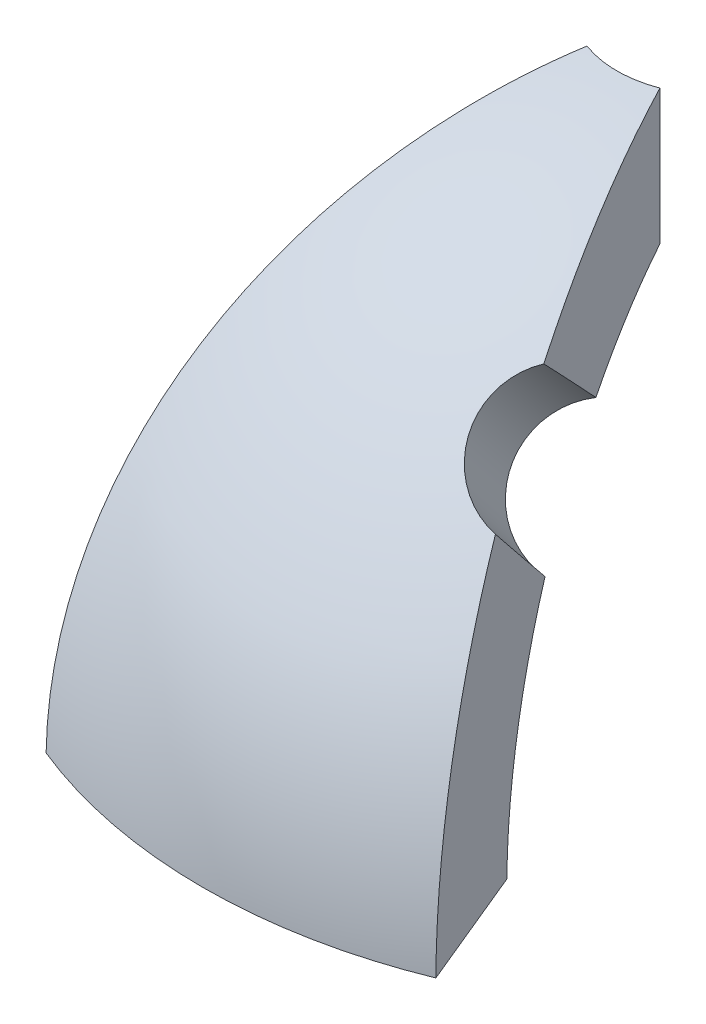
ISO-10303-21;
HEADER;
FILE_DESCRIPTION(('STEP AP214'),'2;1');
FILE_NAME('part.step','',(''),(''),'','','');
FILE_SCHEMA(('AUTOMOTIVE_DESIGN { 1 0 10303 214 1 1 1 1 }'));
ENDSEC;
DATA;
#1=APPLICATION_CONTEXT('core data for automotive mechanical design processes');
#2=APPLICATION_PROTOCOL_DEFINITION('international standard','automotive_design',2000,#1);
#3=PRODUCT_CONTEXT('',#1,'mechanical');
#4=PRODUCT('Part','Part','',(#3));
#5=PRODUCT_RELATED_PRODUCT_CATEGORY('part','',(#4));
#6=PRODUCT_DEFINITION_FORMATION('','',#4);
#7=PRODUCT_DEFINITION_CONTEXT('part definition',#1,'design');
#8=PRODUCT_DEFINITION('design','',#6,#7);
#9=PRODUCT_DEFINITION_SHAPE('','',#8);
#10=(LENGTH_UNIT() NAMED_UNIT(*) SI_UNIT(.MILLI.,.METRE.));
#11=(NAMED_UNIT(*) PLANE_ANGLE_UNIT() SI_UNIT($,.RADIAN.));
#12=(NAMED_UNIT(*) SI_UNIT($,.STERADIAN.) SOLID_ANGLE_UNIT());
#13=UNCERTAINTY_MEASURE_WITH_UNIT(LENGTH_MEASURE(1.E-05),#10,'distance_accuracy_value','');
#14=(GEOMETRIC_REPRESENTATION_CONTEXT(3) GLOBAL_UNCERTAINTY_ASSIGNED_CONTEXT((#13)) GLOBAL_UNIT_ASSIGNED_CONTEXT((#10,
#11,#12)) REPRESENTATION_CONTEXT('',''));
#15=CARTESIAN_POINT('',(0.,0.,0.));
#16=DIRECTION('',(0.,0.,1.));
#17=DIRECTION('',(1.,0.,0.));
#18=AXIS2_PLACEMENT_3D('',#15,#16,#17);
#19=CARTESIAN_POINT('',(7.17384970083417,0.249999999999994,17.6458459833991));
#20=DIRECTION('',(0.923879532511287,0.,-0.382683432365091));
#21=DIRECTION('',(-0.38268343236509,0.,-0.923879532511286));
#22=AXIS2_PLACEMENT_3D('',#19,#20,#21);
#23=PLANE('',#22);
#24=CARTESIAN_POINT('',(-0.723291696660623,-1.59318685539807,-1.41953988241083));
#25=DIRECTION('',(0.923879532511287,0.,-0.382683432365091));
#26=DIRECTION('',(0.270180002552571,0.7081975069357,0.652272226444413));
#27=AXIS2_PLACEMENT_3D('',#24,#25,#26);
#28=ELLIPSE('',#27,46.9277013134413,2.6035);
#29=CARTESIAN_POINT('',(5.62270364454241,11.7494069814732,13.901048137078));
#30=VERTEX_POINT('',#29);
#31=CARTESIAN_POINT('',(4.33112779241204,8.19625663572259,10.7829081980312));
#32=VERTEX_POINT('',#31);
#33=EDGE_CURVE('E11',#30,#32,#28,.T.);
#34=ORIENTED_EDGE('',*,*,#33,.F.);
#35=CARTESIAN_POINT('',(-0.115484941563909,0.,0.0478354290456357));
#36=DIRECTION('',(0.923879532511287,0.,-0.382683432365091));
#37=DIRECTION('',(-0.38268343236509,0.,-0.923879532511286));
#38=AXIS2_PLACEMENT_3D('',#35,#36,#37);
#39=CIRCLE('',#38,19.0495898905987);
#40=CARTESIAN_POINT('',(7.17384970083417,0.249999999999994,17.6458459833991));
#41=VERTEX_POINT('',#40);
#42=EDGE_CURVE('E172',#30,#41,#39,.T.);
#43=ORIENTED_EDGE('',*,*,#42,.T.);
#44=DIRECTION('',(-0.38268343236509,0.,-0.923879532511286));
#45=VECTOR('',#44,1.);
#46=CARTESIAN_POINT('',(5.32543241311731,0.249999999999995,13.1833718984682));
#47=LINE('',#46,#45);
#48=CARTESIAN_POINT('',(5.32522212941495,0.249999999999996,13.182864228702));
#49=VERTEX_POINT('',#48);
#50=EDGE_CURVE('E163',#41,#49,#47,.T.);
#51=ORIENTED_EDGE('',*,*,#50,.T.);
#52=CARTESIAN_POINT('',(-0.115484941563909,0.,0.0478354290456357));
#53=DIRECTION('',(0.923879532511287,0.,-0.382683432365091));
#54=DIRECTION('',(-0.38268343236509,0.,-0.923879532511286));
#55=AXIS2_PLACEMENT_3D('',#52,#53,#54);
#56=CIRCLE('',#55,14.2194505871359);
#57=EDGE_CURVE('E179',#49,#32,#56,.F.);
#58=ORIENTED_EDGE('',*,*,#57,.T.);
#59=EDGE_LOOP('',(#34,#43,#51,#58));
#60=FACE_BOUND('',#59,.T.);
#61=ADVANCED_FACE('F35',(#60),#23,.T.);
#62=CARTESIAN_POINT('',(0.,0.,0.));
#63=DIRECTION('',(0.,-1.,0.));
#64=DIRECTION('',(0.382683432365091,0.,0.923879532511287));
#65=AXIS2_PLACEMENT_3D('',#62,#63,#64);
#66=SPHERICAL_SURFACE('',#65,14.22);
#67=CARTESIAN_POINT('',(-1.48166666666667,0.,0.));
#68=DIRECTION('',(1.,0.,0.));
#69=DIRECTION('',(0.,0.,-1.));
#70=AXIS2_PLACEMENT_3D('',#67,#68,#69);
#71=CIRCLE('',#70,14.1425974944099);
#72=CARTESIAN_POINT('',(-1.48166666666667,2.02649613146278,13.9966559334026));
#73=VERTEX_POINT('',#72);
#74=CARTESIAN_POINT('',(-1.48166666666667,1.55783938000513,14.0565358589872));
#75=VERTEX_POINT('',#74);
#76=EDGE_CURVE('E437',#73,#75,#71,.T.);
#77=ORIENTED_EDGE('',*,*,#76,.T.);
#78=CARTESIAN_POINT('',(0.,-3.64003682813778,1.50775262175221));
#79=DIRECTION('',(0.,0.923879532511287,-0.38268343236509));
#80=DIRECTION('',(0.,0.38268343236509,0.923879532511287));
#81=AXIS2_PLACEMENT_3D('',#78,#79,#80);
#82=CIRCLE('',#81,13.6632797644416);
#83=CARTESIAN_POINT('',(1.53865384615384,1.55541413891811,14.0506808090629));
#84=VERTEX_POINT('',#83);
#85=EDGE_CURVE('E424',#75,#84,#82,.T.);
#86=ORIENTED_EDGE('',*,*,#85,.T.);
#87=CARTESIAN_POINT('',(-1.14656520887621,-0.992633987450935,0.411162460074659));
#88=DIRECTION('',(-0.729691385153425,-0.63172723508972,0.261669988494619));
#89=DIRECTION('',(0.654532858144621,-0.756033555875024,0.));
#90=AXIS2_PLACEMENT_3D('',#87,#88,#89);
#91=CIRCLE('',#90,14.132919423112);
#92=CARTESIAN_POINT('',(-0.185208333333334,3.44115359806134,13.7961066894908));
#93=VERTEX_POINT('',#92);
#94=EDGE_CURVE('E265',#84,#93,#91,.T.);
#95=ORIENTED_EDGE('',*,*,#94,.T.);
#96=CARTESIAN_POINT('',(-1.02576923076923,4.73842442043193,13.3680040206854));
#97=CARTESIAN_POINT('',(-1.01510319695056,4.47777713700594,13.4612115287235));
#98=CARTESIAN_POINT('',(-0.898431747941723,4.23448889858206,13.5478813537785));
#99=CARTESIAN_POINT('',(-0.563340129394557,3.82530552640254,13.6869591415432));
#100=CARTESIAN_POINT('',(-0.374186438591005,3.63370761876325,13.7455410990114));
#101=CARTESIAN_POINT('',(-0.185208333333334,3.44115359806134,13.7961066894908));
#102=B_SPLINE_CURVE_WITH_KNOTS('',3,(#96,#97,#98,#99,#100,#101),.UNSPECIFIED.,.F.,.F.,(4,2,4),
(0.,0.5,1.),.UNSPECIFIED.);
#103=CARTESIAN_POINT('',(-1.02576923076923,4.73842442043193,13.3680040206854));
#104=VERTEX_POINT('',#103);
#105=EDGE_CURVE('E252',#104,#93,#102,.T.);
#106=ORIENTED_EDGE('',*,*,#105,.F.);
#107=CARTESIAN_POINT('',(-0.0614393028846162,5.59206148575123,13.0741528808424));
#108=CARTESIAN_POINT('',(-0.181431455087626,5.58893674778118,13.074925511602));
#109=CARTESIAN_POINT('',(-0.303817751233514,5.57407301691507,13.0789989392794));
#110=CARTESIAN_POINT('',(-0.416529017767411,5.53488020885885,13.091982456868));
#111=CARTESIAN_POINT('',(-0.530319753611987,5.49531203962715,13.1050903214649));
#112=CARTESIAN_POINT('',(-0.636925682618907,5.43243464547075,13.1265404918891));
#113=CARTESIAN_POINT('',(-0.726940523888714,5.35567269757998,13.1528220329755));
#114=CARTESIAN_POINT('',(-0.806313997891765,5.28798538747221,13.1759966249511));
#115=CARTESIAN_POINT('',(-0.876464564094106,5.20767506981655,13.2034748841787));
#116=CARTESIAN_POINT('',(-0.926661813888501,5.11856233540297,13.2344254692554));
#117=CARTESIAN_POINT('',(-0.975537275994764,5.0317961063395,13.2645610674062));
#118=CARTESIAN_POINT('',(-1.00793220659945,4.93487749186068,13.2985067639493));
#119=CARTESIAN_POINT('',(-1.01983995447226,4.83742503827839,13.3329533662388));
#120=CARTESIAN_POINT('',(-1.02385286841137,4.80458353763878,13.3445618796168));
#121=CARTESIAN_POINT('',(-1.02484717427356,4.77148364777918,13.3563565950294));
#122=CARTESIAN_POINT('',(-1.02576923076923,4.73842442043193,13.3680040206854));
#123=B_SPLINE_CURVE_WITH_KNOTS('',3,(#107,#108,#109,#110,#111,#112,#113,#114,#115,#116,#117,
#118,#119,#120,#121,#122),.UNSPECIFIED.,.F.,.F.,(4,3,3,3,3,4),(0.,0.246669412520798,
0.496293305523043,0.715573496650327,0.929171565128119,1.),.UNSPECIFIED.);
#124=CARTESIAN_POINT('',(-0.0614393028846169,5.59206148575123,13.0741528808424));
#125=VERTEX_POINT('',#124);
#126=EDGE_CURVE('E263',#125,#104,#123,.T.);
#127=ORIENTED_EDGE('',*,*,#126,.F.);
#128=CARTESIAN_POINT('',(0.96878205128205,4.62209395592513,13.4129082901403));
#129=CARTESIAN_POINT('',(0.953500775688128,4.77247497543825,13.3621906559668));
#130=CARTESIAN_POINT('',(0.923044847697753,4.92508352699751,13.3088452056543));
#131=CARTESIAN_POINT('',(0.855145508072125,5.06126216850062,13.2612499946924));
#132=CARTESIAN_POINT('',(0.808724977756618,5.15436299674245,13.2287107248628));
#133=CARTESIAN_POINT('',(0.745897012433539,5.24174805606234,13.1980300195728));
#134=CARTESIAN_POINT('',(0.670245705492799,5.31578095080346,13.1720022615145));
#135=CARTESIAN_POINT('',(0.594412641437047,5.38999171432051,13.1459119700988));
#136=CARTESIAN_POINT('',(0.503545715592896,5.45286776380939,13.1237575967041));
#137=CARTESIAN_POINT('',(0.405099082413731,5.49758841111125,13.1080439576408));
#138=CARTESIAN_POINT('',(0.311601318038426,5.54006097120918,13.0931202362785));
#139=CARTESIAN_POINT('',(0.209546117781219,5.56804465052542,13.0832770230575));
#140=CARTESIAN_POINT('',(0.106757843166381,5.58143391070576,13.0784019766701));
#141=CARTESIAN_POINT('',(0.0510947696715673,5.58868461489602,13.0757619862007));
#142=CARTESIAN_POINT('',(-0.00526218903816884,5.59085895447196,13.0749312189617));
#143=CARTESIAN_POINT('',(-0.0614393028846162,5.59206148575123,13.0741528808424));
#144=B_SPLINE_CURVE_WITH_KNOTS('',3,(#128,#129,#130,#131,#132,#133,#134,#135,#136,#137,#138,
#139,#140,#141,#142,#143),.UNSPECIFIED.,.F.,.F.,(4,3,3,3,3,4),(0.,0.298387709774103,
0.500936586454012,0.704289141341412,0.89673405736526,1.),.UNSPECIFIED.);
#145=CARTESIAN_POINT('',(0.96878205128205,4.62209395592513,13.4129082901403));
#146=VERTEX_POINT('',#145);
#147=EDGE_CURVE('E543',#146,#125,#144,.T.);
#148=ORIENTED_EDGE('',*,*,#147,.F.);
#149=CARTESIAN_POINT('',(0.,-0.796975235975162,0.330117951616407));
#150=DIRECTION('',(0.,0.923879532511287,-0.38268343236509));
#151=DIRECTION('',(0.,0.38268343236509,0.923879532511287));
#152=AXIS2_PLACEMENT_3D('',#149,#150,#151);
#153=CIRCLE('',#152,14.1938103626638);
#154=CARTESIAN_POINT('',(1.36769230769231,4.60948536997282,13.3824684709319));
#155=VERTEX_POINT('',#154);
#156=EDGE_CURVE('E555',#146,#155,#153,.T.);
#157=ORIENTED_EDGE('',*,*,#156,.T.);
#158=CARTESIAN_POINT('',(-0.081919070512821,6.00841565746439,12.8880033578915));
#159=CARTESIAN_POINT('',(0.0861624956004355,6.00542114657256,12.8904677700206));
#160=CARTESIAN_POINT('',(0.257167264565181,5.98457253542038,12.8978844396908));
#161=CARTESIAN_POINT('',(0.415863302486591,5.93236189045178,12.9167542406891));
#162=CARTESIAN_POINT('',(0.576051262515946,5.87966040641422,12.9358014391427));
#163=CARTESIAN_POINT('',(0.727060910460557,5.79474850115833,12.9664749514095));
#164=CARTESIAN_POINT('',(0.854625462712611,5.6893688157893,13.004195392119));
#165=CARTESIAN_POINT('',(0.966467495898822,5.59697733194739,13.0372667329197));
#166=CARTESIAN_POINT('',(1.06552463446943,5.4881938867869,13.0757379774391));
#167=CARTESIAN_POINT('',(1.14372693429423,5.36879958258044,13.1177848641402));
#168=CARTESIAN_POINT('',(1.23258494871155,5.23313681015187,13.1655609893062));
#169=CARTESIAN_POINT('',(1.29486443738675,5.07971491243854,13.219561459815));
#170=CARTESIAN_POINT('',(1.32944724900957,4.92345524328022,13.274055841359));
#171=CARTESIAN_POINT('',(1.35224515215387,4.82044474078882,13.3099799774848));
#172=CARTESIAN_POINT('',(1.36223638649342,4.71490535377315,13.3467149884847));
#173=CARTESIAN_POINT('',(1.36769230769231,4.60948536997282,13.3824684709319));
#174=B_SPLINE_CURVE_WITH_KNOTS('',3,(#158,#159,#160,#161,#162,#163,#164,#165,#166,#167,#168,
#169,#170,#171,#172,#173),.UNSPECIFIED.,.F.,.F.,(4,3,3,3,3,4),(0.,0.21932127120366,
0.441568870801488,0.635043826918676,0.855885189682541,1.),.UNSPECIFIED.);
#175=CARTESIAN_POINT('',(-0.081919070512821,6.00841565746439,12.8880033578915));
#176=VERTEX_POINT('',#175);
#177=EDGE_CURVE('E205',#176,#155,#174,.T.);
#178=ORIENTED_EDGE('',*,*,#177,.F.);
#179=CARTESIAN_POINT('',(-1.42467948717949,4.75880335688474,13.3241314527181));
#180=CARTESIAN_POINT('',(-1.41998123570896,4.90687898443499,13.2717476036515));
#181=CARTESIAN_POINT('',(-1.39870962604896,5.05722855256801,13.2174560064247));
#182=CARTESIAN_POINT('',(-1.34521028583592,5.19644980960188,13.1679808119229));
#183=CARTESIAN_POINT('',(-1.29129419152762,5.33675558522578,13.1181202109873));
#184=CARTESIAN_POINT('',(-1.20654594179884,5.46873177523107,13.0717519252903));
#185=CARTESIAN_POINT('',(-1.10337881431458,5.5820880392036,13.031931871933));
#186=CARTESIAN_POINT('',(-1.00734704400751,5.68760423384941,12.9948658964534));
#187=CARTESIAN_POINT('',(-0.89204271975123,5.78069257376337,12.9621750801536));
#188=CARTESIAN_POINT('',(-0.763987364254898,5.84976700409645,12.938506455733));
#189=CARTESIAN_POINT('',(-0.637629389595678,5.91792584902564,12.9151515602413));
#190=CARTESIAN_POINT('',(-0.495452932696475,5.963036029263,12.9006311908464));
#191=CARTESIAN_POINT('',(-0.352111836121691,5.98671363109362,12.8935517664506));
#192=CARTESIAN_POINT('',(-0.263052546929301,6.00142476725208,12.8891532476751));
#193=CARTESIAN_POINT('',(-0.172266932809541,6.00631316004938,12.8884092753436));
#194=CARTESIAN_POINT('',(-0.081919070512821,6.00841565746439,12.8880033578915));
#195=B_SPLINE_CURVE_WITH_KNOTS('',3,(#179,#180,#181,#182,#183,#184,#185,#186,#187,#188,#189,
#190,#191,#192,#193,#194),.UNSPECIFIED.,.F.,.F.,(4,3,3,3,3,4),(0.,0.225059700254862,
0.452233868898472,0.663328732256531,0.871773853131729,1.),.UNSPECIFIED.);
#196=CARTESIAN_POINT('',(-1.42467948717949,4.75880335688474,13.3241314527181));
#197=VERTEX_POINT('',#196);
#198=EDGE_CURVE('E486',#197,#176,#195,.T.);
#199=ORIENTED_EDGE('',*,*,#198,.F.);
#200=CARTESIAN_POINT('',(-0.525350560897436,3.2442652953704,13.8349972707413));
#201=CARTESIAN_POINT('',(-0.632201272296191,3.35575537641877,13.8047957843433));
#202=CARTESIAN_POINT('',(-0.739042664643172,3.46670622004078,13.7720340969026));
#203=CARTESIAN_POINT('',(-0.841026473048858,3.58098602122257,13.7359970001249));
#204=CARTESIAN_POINT('',(-0.943081146769884,3.69534523181527,13.6999348623111));
#205=CARTESIAN_POINT('',(-1.04286701773542,3.81135655581517,13.6608631956778));
#206=CARTESIAN_POINT('',(-1.13229165399977,3.93369725051855,13.6180887628017));
#207=CARTESIAN_POINT('',(-1.22232558824778,4.05687151795665,13.5750228847848));
#208=CARTESIAN_POINT('',(-1.30224104615334,4.18934413108763,13.5272723299399));
#209=CARTESIAN_POINT('',(-1.35193880802276,4.33114269520524,13.4767156389504));
#210=CARTESIAN_POINT('',(-1.39999144873719,4.46824736952176,13.4278325018342));
#211=CARTESIAN_POINT('',(-1.41936389597814,4.61471676287508,13.3761613192398));
#212=CARTESIAN_POINT('',(-1.42467948717949,4.75880335688474,13.3241314527181));
#213=B_SPLINE_CURVE_WITH_KNOTS('',3,(#200,#201,#202,#203,#204,#205,#206,#207,#208,#209,#210,
#211,#212),.UNSPECIFIED.,.F.,.F.,(4,3,3,3,4),(0.,0.250309737661891,0.500902382459267,
0.754675062567994,1.),.UNSPECIFIED.);
#214=CARTESIAN_POINT('',(-0.525350560897436,3.2442652953704,13.8349972707413));
#215=VERTEX_POINT('',#214);
#216=EDGE_CURVE('E473',#215,#197,#213,.T.);
#217=ORIENTED_EDGE('',*,*,#216,.F.);
#218=CARTESIAN_POINT('',(-1.42587669325281,-1.23432522706951,0.51127424943144));
#219=DIRECTION('',(0.729724964678345,0.63169412683933,-0.261656274608281));
#220=DIRECTION('',(-0.654496033439333,0.756065435139168,0.));
#221=AXIS2_PLACEMENT_3D('',#218,#219,#220);
#222=CIRCLE('',#221,14.085109709595);
#223=CARTESIAN_POINT('',(0.58678986378205,2.05227237713008,14.0588852952797));
#224=VERTEX_POINT('',#223);
#225=EDGE_CURVE('E464',#215,#224,#222,.T.);
#226=ORIENTED_EDGE('',*,*,#225,.T.);
#227=CARTESIAN_POINT('',(0.,-3.21884251818776,1.33328822617653));
#228=DIRECTION('',(0.,-0.923879532511287,0.38268343236509));
#229=DIRECTION('',(0.,-0.38268343236509,-0.923879532511287));
#230=AXIS2_PLACEMENT_3D('',#227,#228,#229);
#231=CIRCLE('',#230,13.7865802630328);
#232=EDGE_CURVE('E450',#224,#73,#231,.T.);
#233=ORIENTED_EDGE('',*,*,#232,.T.);
#234=EDGE_LOOP('',(#77,#86,#95,#106,#127,#148,#157,#178,#199,#217,#226,#233));
#235=FACE_BOUND('',#234,.T.);
#236=CARTESIAN_POINT('',(3.00734318049026,11.6448089223943,7.58700943426889));
#237=VERTEX_POINT('',#236);
#238=CARTESIAN_POINT('',(1.34175402255179,13.7000839413487,3.56592149983228));
#239=VERTEX_POINT('',#238);
#240=EDGE_CURVE('E177',#237,#239,#56,.F.);
#241=ORIENTED_EDGE('',*,*,#240,.F.);
#242=CARTESIAN_POINT('',(4.48773900583013,9.88509453040283,8.80768371880774));
#243=DIRECTION('',(-0.321019760960095,-0.707106781186548,-0.630036755335055));
#244=DIRECTION('',(0.,0.665246597127311,-0.746623710452952));
#245=AXIS2_PLACEMENT_3D('',#242,#243,#244);
#246=CIRCLE('',#245,2.6035);
#247=EDGE_CURVE('E49',#237,#32,#246,.F.);
#248=ORIENTED_EDGE('',*,*,#247,.T.);
#249=ORIENTED_EDGE('',*,*,#57,.F.);
#250=CARTESIAN_POINT('',(0.,0.249999999999996,0.));
#251=DIRECTION('',(0.,-1.,0.));
#252=DIRECTION('',(0.,0.,-1.));
#253=AXIS2_PLACEMENT_3D('',#250,#251,#252);
#254=CIRCLE('',#253,14.2178022211592);
#255=CARTESIAN_POINT('',(-5.32522212941495,0.249999999999996,13.182864228702));
#256=VERTEX_POINT('',#255);
#257=EDGE_CURVE('E186',#49,#256,#254,.T.);
#258=ORIENTED_EDGE('',*,*,#257,.T.);
#259=CARTESIAN_POINT('',(0.115484941563912,0.,0.0478354290456367));
#260=DIRECTION('',(-0.923879532511286,0.,-0.382683432365091));
#261=DIRECTION('',(-0.382683432365091,0.,0.923879532511286));
#262=AXIS2_PLACEMENT_3D('',#259,#260,#261);
#263=CIRCLE('',#262,14.2194505871359);
#264=CARTESIAN_POINT('',(-1.34175402255179,13.7000839413487,3.56592149983228));
#265=VERTEX_POINT('',#264);
#266=EDGE_CURVE('E181',#265,#256,#263,.F.);
#267=ORIENTED_EDGE('',*,*,#266,.F.);
#268=CARTESIAN_POINT('',(0.,13.7000839413487,0.));
#269=DIRECTION('',(0.,-1.,0.));
#270=DIRECTION('',(0.,0.,-1.));
#271=AXIS2_PLACEMENT_3D('',#268,#269,#270);
#272=CIRCLE('',#271,3.81);
#273=EDGE_CURVE('E194',#239,#265,#272,.T.);
#274=ORIENTED_EDGE('',*,*,#273,.F.);
#275=EDGE_LOOP('',(#241,#248,#249,#258,#267,#274));
#276=FACE_BOUND('',#275,.T.);
#277=ADVANCED_FACE('F211',(#235,#276),#66,.F.);
#278=CARTESIAN_POINT('',(0.,0.,0.));
#279=DIRECTION('',(0.,-1.,0.));
#280=DIRECTION('',(0.,0.,-1.));
#281=AXIS2_PLACEMENT_3D('',#278,#279,#280);
#282=CYLINDRICAL_SURFACE('',#281,3.81);
#283=DIRECTION('',(0.,-1.,0.));
#284=VECTOR('',#283,1.);
#285=CARTESIAN_POINT('',(1.34175402255179,0.249999999999994,3.56592149983228));
#286=LINE('',#285,#284);
#287=CARTESIAN_POINT('',(1.34175402255179,18.6651118400078,3.56592149983228));
#288=VERTEX_POINT('',#287);
#289=EDGE_CURVE('E176',#288,#239,#286,.T.);
#290=ORIENTED_EDGE('',*,*,#289,.T.);
#291=ORIENTED_EDGE('',*,*,#273,.T.);
#292=DIRECTION('',(0.,-1.,0.));
#293=VECTOR('',#292,1.);
#294=CARTESIAN_POINT('',(-1.34175402255179,0.249999999999994,3.56592149983228));
#295=LINE('',#294,#293);
#296=CARTESIAN_POINT('',(-1.34175402255179,18.6651118400078,3.56592149983228));
#297=VERTEX_POINT('',#296);
#298=EDGE_CURVE('E579',#297,#265,#295,.T.);
#299=ORIENTED_EDGE('',*,*,#298,.F.);
#300=CARTESIAN_POINT('',(0.,18.6651118400078,0.));
#301=DIRECTION('',(0.,-1.,0.));
#302=DIRECTION('',(0.,0.,-1.));
#303=AXIS2_PLACEMENT_3D('',#300,#301,#302);
#304=CIRCLE('',#303,3.81);
#305=EDGE_CURVE('E192',#288,#297,#304,.T.);
#306=ORIENTED_EDGE('',*,*,#305,.F.);
#307=EDGE_LOOP('',(#290,#291,#299,#306));
#308=FACE_BOUND('',#307,.T.);
#309=ADVANCED_FACE('F37',(#308),#282,.F.);
#310=CARTESIAN_POINT('',(0.,0.,0.));
#311=DIRECTION('',(0.,-1.,0.));
#312=DIRECTION('',(0.382683432365091,0.,0.923879532511287));
#313=AXIS2_PLACEMENT_3D('',#310,#311,#312);
#314=SPHERICAL_SURFACE('',#313,19.05);
#315=ORIENTED_EDGE('',*,*,#42,.F.);
#316=CARTESIAN_POINT('',(6.05804596027839,13.3439928010697,11.8895846444758));
#317=DIRECTION('',(-0.321019760960095,-0.707106781186548,-0.630036755335055));
#318=DIRECTION('',(0.,0.665246597127311,-0.746623710452952));
#319=AXIS2_PLACEMENT_3D('',#316,#317,#318);
#320=CIRCLE('',#319,2.6035);
#321=CARTESIAN_POINT('',(4.3630808358188,15.0308132451866,10.860049668783));
#322=VERTEX_POINT('',#321);
#323=EDGE_CURVE('E158',#30,#322,#320,.T.);
#324=ORIENTED_EDGE('',*,*,#323,.T.);
#325=EDGE_CURVE('E169',#288,#322,#39,.T.);
#326=ORIENTED_EDGE('',*,*,#325,.F.);
#327=ORIENTED_EDGE('',*,*,#305,.T.);
#328=CARTESIAN_POINT('',(0.115484941563912,0.,0.0478354290456367));
#329=DIRECTION('',(-0.923879532511286,0.,-0.382683432365091));
#330=DIRECTION('',(-0.382683432365091,0.,0.923879532511286));
#331=AXIS2_PLACEMENT_3D('',#328,#329,#330);
#332=CIRCLE('',#331,19.0495898905987);
#333=CARTESIAN_POINT('',(-7.17384970083417,0.249999999999995,17.6458459833991));
#334=VERTEX_POINT('',#333);
#335=EDGE_CURVE('E646',#334,#297,#332,.T.);
#336=ORIENTED_EDGE('',*,*,#335,.F.);
#337=CARTESIAN_POINT('',(0.,0.249999999999994,0.));
#338=DIRECTION('',(0.,-1.,0.));
#339=DIRECTION('',(0.,0.,-1.));
#340=AXIS2_PLACEMENT_3D('',#337,#338,#339);
#341=CIRCLE('',#340,19.0483595094171);
#342=EDGE_CURVE('E189',#41,#334,#341,.T.);
#343=ORIENTED_EDGE('',*,*,#342,.F.);
#344=EDGE_LOOP('',(#315,#324,#326,#327,#336,#343));
#345=FACE_BOUND('',#344,.T.);
#346=ADVANCED_FACE('F167',(#345),#314,.T.);
#347=CARTESIAN_POINT('',(5.44091735468122,0.249999999999995,13.1355364694225));
#348=DIRECTION('',(0.,1.,0.));
#349=DIRECTION('',(0.,0.,1.));
#350=AXIS2_PLACEMENT_3D('',#347,#348,#349);
#351=PLANE('',#350);
#352=ORIENTED_EDGE('',*,*,#50,.F.);
#353=ORIENTED_EDGE('',*,*,#342,.T.);
#354=DIRECTION('',(-0.382683432365091,0.,0.923879532511286));
#355=VECTOR('',#354,1.);
#356=CARTESIAN_POINT('',(-3.73182461580675,0.249999999999995,9.33606234109748));
#357=LINE('',#356,#355);
#358=EDGE_CURVE('E197',#256,#334,#357,.T.);
#359=ORIENTED_EDGE('',*,*,#358,.F.);
#360=ORIENTED_EDGE('',*,*,#257,.F.);
#361=EDGE_LOOP('',(#352,#353,#359,#360));
#362=FACE_BOUND('',#361,.T.);
#363=ADVANCED_FACE('F223',(#362),#351,.F.);
#364=CARTESIAN_POINT('',(-7.17384970083417,0.249999999999994,17.6458459833991));
#365=DIRECTION('',(-0.923879532511286,0.,-0.382683432365091));
#366=DIRECTION('',(-0.382683432365091,0.,0.923879532511286));
#367=AXIS2_PLACEMENT_3D('',#364,#365,#366);
#368=PLANE('',#367);
#369=ORIENTED_EDGE('',*,*,#266,.T.);
#370=ORIENTED_EDGE('',*,*,#358,.T.);
#371=ORIENTED_EDGE('',*,*,#335,.T.);
#372=ORIENTED_EDGE('',*,*,#298,.T.);
#373=EDGE_LOOP('',(#369,#370,#371,#372));
#374=FACE_BOUND('',#373,.T.);
#375=ADVANCED_FACE('F221',(#374),#368,.T.);
#376=EDGE_CURVE('E39',#237,#322,#28,.T.);
#377=ORIENTED_EDGE('',*,*,#376,.F.);
#378=ORIENTED_EDGE('',*,*,#240,.T.);
#379=ORIENTED_EDGE('',*,*,#289,.F.);
#380=ORIENTED_EDGE('',*,*,#325,.T.);
#381=EDGE_LOOP('',(#377,#378,#379,#380));
#382=FACE_BOUND('',#381,.T.);
#383=ADVANCED_FACE('F174',(#382),#23,.T.);
#384=CARTESIAN_POINT('',(0.,0.145802387731092,0.3519981018868));
#385=DIRECTION('',(0.,-1.,0.));
#386=DIRECTION('',(0.382683432365091,0.,0.923879532511287));
#387=AXIS2_PLACEMENT_3D('',#384,#385,#386);
#388=SPHERICAL_SURFACE('',#387,14.22);
#389=CARTESIAN_POINT('',(0.,-0.651172848244062,0.682116053503207));
#390=DIRECTION('',(0.,0.923879532511287,-0.38268343236509));
#391=DIRECTION('',(0.,0.38268343236509,0.923879532511287));
#392=AXIS2_PLACEMENT_3D('',#389,#390,#391);
#393=CIRCLE('',#392,14.1938103626638);
#394=CARTESIAN_POINT('',(0.96878205128205,4.76789634365623,13.7649063920271));
#395=VERTEX_POINT('',#394);
#396=CARTESIAN_POINT('',(1.36769230769231,4.75528775770392,13.7344665728187));
#397=VERTEX_POINT('',#396);
#398=EDGE_CURVE('E556',#395,#397,#393,.T.);
#399=ORIENTED_EDGE('',*,*,#398,.F.);
#400=CARTESIAN_POINT('',(-0.0614393028846162,5.73786387348233,13.4261509827292));
#401=CARTESIAN_POINT('',(-0.00526218903816884,5.73666134220306,13.4269293208485));
#402=CARTESIAN_POINT('',(0.0510947696715673,5.73448700262712,13.4277600880875));
#403=CARTESIAN_POINT('',(0.106757843166381,5.72723629843686,13.4304000785569));
#404=CARTESIAN_POINT('',(0.209546117781219,5.71384703825652,13.4352751249443));
#405=CARTESIAN_POINT('',(0.311601318038426,5.68586335894028,13.4451183381653));
#406=CARTESIAN_POINT('',(0.405099082413731,5.64339079884235,13.4600420595276));
#407=CARTESIAN_POINT('',(0.503545715592896,5.59867015154049,13.4757556985909));
#408=CARTESIAN_POINT('',(0.594412641437047,5.53579410205161,13.4979100719856));
#409=CARTESIAN_POINT('',(0.670245705492799,5.46158333853455,13.5240003634013));
#410=CARTESIAN_POINT('',(0.745897012433539,5.38755044379344,13.5500281214596));
#411=CARTESIAN_POINT('',(0.808724977756618,5.30016538447355,13.5807088267496));
#412=CARTESIAN_POINT('',(0.855145508072125,5.20706455623172,13.6132480965792));
#413=CARTESIAN_POINT('',(0.923044847697753,5.07088591472861,13.6608433075411));
#414=CARTESIAN_POINT('',(0.953500775688128,4.91827736316935,13.7141887578536));
#415=CARTESIAN_POINT('',(0.96878205128205,4.76789634365623,13.7649063920271));
#416=B_SPLINE_CURVE_WITH_KNOTS('',3,(#400,#401,#402,#403,#404,#405,#406,#407,#408,#409,#410,
#411,#412,#413,#414,#415),.UNSPECIFIED.,.F.,.F.,(4,3,3,3,3,4),(0.,0.10326594263474,
0.295710858658588,0.499063413545988,0.701612290225897,1.),.UNSPECIFIED.);
#417=CARTESIAN_POINT('',(-0.0614393028846169,5.73786387348233,13.4261509827292));
#418=VERTEX_POINT('',#417);
#419=EDGE_CURVE('E567',#395,#418,#416,.F.);
#420=ORIENTED_EDGE('',*,*,#419,.T.);
#421=CARTESIAN_POINT('',(-1.02576923076923,4.88422680816303,13.7200021225722));
#422=CARTESIAN_POINT('',(-1.02484717427356,4.91728603551028,13.7083546969162));
#423=CARTESIAN_POINT('',(-1.02385286841137,4.95038592536987,13.6965599815036));
#424=CARTESIAN_POINT('',(-1.01983995447226,4.98322742600949,13.6849514681256));
#425=CARTESIAN_POINT('',(-1.00793220659945,5.08067987959178,13.6505048658361));
#426=CARTESIAN_POINT('',(-0.975537275994764,5.1775984940706,13.616559169293));
#427=CARTESIAN_POINT('',(-0.926661813888501,5.26436472313407,13.5864235711422));
#428=CARTESIAN_POINT('',(-0.876464564094106,5.35347745754764,13.5554729860655));
#429=CARTESIAN_POINT('',(-0.806313997891765,5.43378777520331,13.5279947268379));
#430=CARTESIAN_POINT('',(-0.726940523888714,5.50147508531108,13.5048201348623));
#431=CARTESIAN_POINT('',(-0.636925682618907,5.57823703320185,13.4785385937759));
#432=CARTESIAN_POINT('',(-0.530319753611987,5.64111442735824,13.4570884233517));
#433=CARTESIAN_POINT('',(-0.416529017767411,5.68068259658995,13.4439805587548));
#434=CARTESIAN_POINT('',(-0.303817751233514,5.71987540464617,13.4309970411662));
#435=CARTESIAN_POINT('',(-0.181431455087626,5.73473913551228,13.4269236134888));
#436=CARTESIAN_POINT('',(-0.0614393028846162,5.73786387348233,13.4261509827292));
#437=B_SPLINE_CURVE_WITH_KNOTS('',3,(#421,#422,#423,#424,#425,#426,#427,#428,#429,#430,#431,
#432,#433,#434,#435,#436),.UNSPECIFIED.,.F.,.F.,(4,3,3,3,3,4),(0.,0.070828434871881,
0.284426503349673,0.503706694476957,0.753330587479202,1.),.UNSPECIFIED.);
#438=CARTESIAN_POINT('',(-1.02576923076923,4.88422680816303,13.7200021225722));
#439=VERTEX_POINT('',#438);
#440=EDGE_CURVE('E271',#418,#439,#437,.F.);
#441=ORIENTED_EDGE('',*,*,#440,.T.);
#442=CARTESIAN_POINT('',(-0.185208333333334,3.58695598579244,14.1481047913776));
#443=CARTESIAN_POINT('',(-0.374186438591005,3.77951000649435,14.0975392008982));
#444=CARTESIAN_POINT('',(-0.563340129394557,3.97110791413364,14.03895724343));
#445=CARTESIAN_POINT('',(-0.898431747941723,4.38029128631316,13.8998794556653));
#446=CARTESIAN_POINT('',(-1.01510319695056,4.62357952473704,13.8132096306103));
#447=CARTESIAN_POINT('',(-1.02576923076923,4.88422680816303,13.7200021225722));
#448=B_SPLINE_CURVE_WITH_KNOTS('',3,(#442,#443,#444,#445,#446,#447),.UNSPECIFIED.,.F.,.F.,(4,2,
4),(0.,0.5,1.),.UNSPECIFIED.);
#449=CARTESIAN_POINT('',(-0.185208333333334,3.58695598579244,14.1481047913776));
#450=VERTEX_POINT('',#449);
#451=EDGE_CURVE('E276',#439,#450,#448,.F.);
#452=ORIENTED_EDGE('',*,*,#451,.T.);
#453=CARTESIAN_POINT('',(-1.14656520887621,-0.846831599719835,0.763160561961459));
#454=DIRECTION('',(-0.729691385153425,-0.63172723508972,0.261669988494619));
#455=DIRECTION('',(0.654532858144621,-0.756033555875024,0.));
#456=AXIS2_PLACEMENT_3D('',#453,#454,#455);
#457=CIRCLE('',#456,14.132919423112);
#458=CARTESIAN_POINT('',(1.53865384615384,1.70121652664921,14.4026789109497));
#459=VERTEX_POINT('',#458);
#460=EDGE_CURVE('E423',#459,#450,#457,.T.);
#461=ORIENTED_EDGE('',*,*,#460,.F.);
#462=CARTESIAN_POINT('',(0.,-3.49423444040668,1.85975072363901));
#463=DIRECTION('',(0.,0.923879532511287,-0.38268343236509));
#464=DIRECTION('',(0.,0.38268343236509,0.923879532511287));
#465=AXIS2_PLACEMENT_3D('',#462,#463,#464);
#466=CIRCLE('',#465,13.6632797644416);
#467=CARTESIAN_POINT('',(-1.48166666666667,1.70364176773623,14.408533960874));
#468=VERTEX_POINT('',#467);
#469=EDGE_CURVE('E428',#468,#459,#466,.T.);
#470=ORIENTED_EDGE('',*,*,#469,.F.);
#471=CARTESIAN_POINT('',(-1.48166666666667,0.145802387731092,0.3519981018868));
#472=DIRECTION('',(1.,0.,0.));
#473=DIRECTION('',(0.,0.,-1.));
#474=AXIS2_PLACEMENT_3D('',#471,#472,#473);
#475=CIRCLE('',#474,14.1425974944099);
#476=CARTESIAN_POINT('',(-1.48166666666667,2.17229851919388,14.3486540352894));
#477=VERTEX_POINT('',#476);
#478=EDGE_CURVE('E441',#477,#468,#475,.T.);
#479=ORIENTED_EDGE('',*,*,#478,.F.);
#480=CARTESIAN_POINT('',(0.,-3.07304013045666,1.68528632806333));
#481=DIRECTION('',(0.,-0.923879532511287,0.38268343236509));
#482=DIRECTION('',(0.,-0.38268343236509,-0.923879532511287));
#483=AXIS2_PLACEMENT_3D('',#480,#481,#482);
#484=CIRCLE('',#483,13.7865802630328);
#485=CARTESIAN_POINT('',(0.58678986378205,2.19807476486118,14.4108833971665));
#486=VERTEX_POINT('',#485);
#487=EDGE_CURVE('E455',#486,#477,#484,.T.);
#488=ORIENTED_EDGE('',*,*,#487,.F.);
#489=CARTESIAN_POINT('',(-1.42587669325281,-1.08852283933841,0.86327235131824));
#490=DIRECTION('',(0.729724964678345,0.63169412683933,-0.261656274608281));
#491=DIRECTION('',(-0.654496033439333,0.756065435139168,0.));
#492=AXIS2_PLACEMENT_3D('',#489,#490,#491);
#493=CIRCLE('',#492,14.085109709595);
#494=CARTESIAN_POINT('',(-0.525350560897436,3.3900676831015,14.1869953726281));
#495=VERTEX_POINT('',#494);
#496=EDGE_CURVE('E469',#495,#486,#493,.T.);
#497=ORIENTED_EDGE('',*,*,#496,.F.);
#498=CARTESIAN_POINT('',(-1.42467948717949,4.90460574461584,13.6761295546049));
#499=CARTESIAN_POINT('',(-1.41936389597814,4.76051915060618,13.7281594211266));
#500=CARTESIAN_POINT('',(-1.39999144873719,4.61404975725286,13.779830603721));
#501=CARTESIAN_POINT('',(-1.35193880802276,4.47694508293634,13.8287137408372));
#502=CARTESIAN_POINT('',(-1.30224104615334,4.33514651881873,13.8792704318267));
#503=CARTESIAN_POINT('',(-1.22232558824778,4.20267390568775,13.9270209866716));
#504=CARTESIAN_POINT('',(-1.13229165399977,4.07949963824965,13.9700868646885));
#505=CARTESIAN_POINT('',(-1.04286701773542,3.95715894354627,14.0128612975646));
#506=CARTESIAN_POINT('',(-0.943081146769884,3.84114761954637,14.0519329641979));
#507=CARTESIAN_POINT('',(-0.841026473048858,3.72678840895367,14.0879951020117));
#508=CARTESIAN_POINT('',(-0.739042664643172,3.61250860777188,14.1240321987894));
#509=CARTESIAN_POINT('',(-0.632201272296191,3.50155776414987,14.1567938862301));
#510=CARTESIAN_POINT('',(-0.525350560897436,3.3900676831015,14.1869953726281));
#511=B_SPLINE_CURVE_WITH_KNOTS('',3,(#498,#499,#500,#501,#502,#503,#504,#505,#506,#507,#508,
#509,#510),.UNSPECIFIED.,.F.,.F.,(4,3,3,3,4),(0.,0.245324937432006,0.499097617540733,
0.749690262338109,1.),.UNSPECIFIED.);
#512=CARTESIAN_POINT('',(-1.42467948717949,4.90460574461584,13.6761295546049));
#513=VERTEX_POINT('',#512);
#514=EDGE_CURVE('E378',#495,#513,#511,.F.);
#515=ORIENTED_EDGE('',*,*,#514,.T.);
#516=CARTESIAN_POINT('',(-0.081919070512821,6.15421804519548,13.2400014597783));
#517=CARTESIAN_POINT('',(-0.172266932809541,6.15211554778048,13.2404073772304));
#518=CARTESIAN_POINT('',(-0.263052546929301,6.14722715498318,13.2411513495619));
#519=CARTESIAN_POINT('',(-0.352111836121691,6.13251601882471,13.2455498683374));
#520=CARTESIAN_POINT('',(-0.495452932696475,6.1088384169941,13.2526292927332));
#521=CARTESIAN_POINT('',(-0.637629389595678,6.06372823675674,13.2671496621281));
#522=CARTESIAN_POINT('',(-0.763987364254898,5.99556939182755,13.2905045576198));
#523=CARTESIAN_POINT('',(-0.89204271975123,5.92649496149447,13.3141731820404));
#524=CARTESIAN_POINT('',(-1.00734704400751,5.8334066215805,13.3468639983402));
#525=CARTESIAN_POINT('',(-1.10337881431458,5.72789042693469,13.3839299738198));
#526=CARTESIAN_POINT('',(-1.20654594179884,5.61453416296217,13.4237500271771));
#527=CARTESIAN_POINT('',(-1.29129419152762,5.48255797295687,13.4701183128741));
#528=CARTESIAN_POINT('',(-1.34521028583592,5.34225219733298,13.5199789138097));
#529=CARTESIAN_POINT('',(-1.39870962604896,5.20303094029911,13.5694541083115));
#530=CARTESIAN_POINT('',(-1.41998123570896,5.05268137216608,13.6237457055383));
#531=CARTESIAN_POINT('',(-1.42467948717949,4.90460574461584,13.6761295546049));
#532=B_SPLINE_CURVE_WITH_KNOTS('',3,(#516,#517,#518,#519,#520,#521,#522,#523,#524,#525,#526,
#527,#528,#529,#530,#531),.UNSPECIFIED.,.F.,.F.,(4,3,3,3,3,4),(0.,0.128226146868271,
0.336671267743469,0.547766131101528,0.774940299745138,1.),.UNSPECIFIED.);
#533=CARTESIAN_POINT('',(-0.0819190705128208,6.15421804519549,13.2400014597783));
#534=VERTEX_POINT('',#533);
#535=EDGE_CURVE('E487',#513,#534,#532,.F.);
#536=ORIENTED_EDGE('',*,*,#535,.T.);
#537=CARTESIAN_POINT('',(1.36769230769231,4.75528775770392,13.7344665728187));
#538=CARTESIAN_POINT('',(1.36223638649342,4.86070774150425,13.6987130903715));
#539=CARTESIAN_POINT('',(1.35224515215387,4.96624712851992,13.6619780793716));
#540=CARTESIAN_POINT('',(1.32944724900957,5.06925763101132,13.6260539432458));
#541=CARTESIAN_POINT('',(1.29486443738675,5.22551730016963,13.5715595617018));
#542=CARTESIAN_POINT('',(1.23258494871155,5.37893919788297,13.517559091193));
#543=CARTESIAN_POINT('',(1.14372693429423,5.51460197031154,13.469782966027));
#544=CARTESIAN_POINT('',(1.06552463446943,5.633996274518,13.4277360793259));
#545=CARTESIAN_POINT('',(0.966467495898822,5.74277971967849,13.3892648348065));
#546=CARTESIAN_POINT('',(0.854625462712611,5.8351712035204,13.3561934940058));
#547=CARTESIAN_POINT('',(0.727060910460557,5.94055088888943,13.3184730532963));
#548=CARTESIAN_POINT('',(0.576051262515946,6.02546279414532,13.2877995410295));
#549=CARTESIAN_POINT('',(0.415863302486591,6.07816427818288,13.2687523425759));
#550=CARTESIAN_POINT('',(0.257167264565181,6.13037492315148,13.2498825415776));
#551=CARTESIAN_POINT('',(0.0861624956004355,6.15122353430366,13.2424658719074));
#552=CARTESIAN_POINT('',(-0.081919070512821,6.15421804519549,13.2400014597783));
#553=B_SPLINE_CURVE_WITH_KNOTS('',3,(#537,#538,#539,#540,#541,#542,#543,#544,#545,#546,#547,
#548,#549,#550,#551,#552),.UNSPECIFIED.,.F.,.F.,(4,3,3,3,3,4),(0.,0.144114810317459,
0.364956173081324,0.558431129198512,0.78067872879634,1.),.UNSPECIFIED.);
#554=EDGE_CURVE('E495',#534,#397,#553,.F.);
#555=ORIENTED_EDGE('',*,*,#554,.T.);
#556=EDGE_LOOP('',(#399,#420,#441,#452,#461,#470,#479,#488,#497,#515,#536,#555));
#557=FACE_BOUND('',#556,.T.);
#558=ADVANCED_FACE('F383',(#557),#388,.F.);
#559=CARTESIAN_POINT('',(1.36769230769231,4.60948536997282,13.3824684709319));
#560=DIRECTION('',(0.,-0.923879532511287,0.38268343236509));
#561=DIRECTION('',(0.,-0.38268343236509,-0.923879532511287));
#562=AXIS2_PLACEMENT_3D('',#559,#560,#561);
#563=PLANE('',#562);
#564=ORIENTED_EDGE('',*,*,#398,.T.);
#565=DIRECTION('',(0.,0.38268343236509,0.923879532511287));
#566=VECTOR('',#565,1.);
#567=CARTESIAN_POINT('',(1.36769230769231,4.60948536997282,13.3824684709319));
#568=LINE('',#567,#566);
#569=EDGE_CURVE('E497',#155,#397,#568,.T.);
#570=ORIENTED_EDGE('',*,*,#569,.F.);
#571=ORIENTED_EDGE('',*,*,#156,.F.);
#572=DIRECTION('',(0.,0.38268343236509,0.923879532511287));
#573=VECTOR('',#572,1.);
#574=CARTESIAN_POINT('',(0.96878205128205,4.62209395592513,13.4129082901403));
#575=LINE('',#574,#573);
#576=EDGE_CURVE('E547',#146,#395,#575,.T.);
#577=ORIENTED_EDGE('',*,*,#576,.T.);
#578=EDGE_LOOP('',(#564,#570,#571,#577));
#579=FACE_BOUND('',#578,.T.);
#580=ADVANCED_FACE('F391',(#579),#563,.F.);
#581=CARTESIAN_POINT('',(0.58678986378205,2.05227237713008,14.0588852952797));
#582=DIRECTION('',(-0.729724964678345,-0.63169412683933,0.261656274608281));
#583=DIRECTION('',(0.654496033439333,-0.756065435139168,0.));
#584=AXIS2_PLACEMENT_3D('',#581,#582,#583);
#585=PLANE('',#584);
#586=ORIENTED_EDGE('',*,*,#496,.T.);
#587=DIRECTION('',(0.,0.38268343236509,0.923879532511287));
#588=VECTOR('',#587,1.);
#589=CARTESIAN_POINT('',(0.58678986378205,2.05227237713008,14.0588852952797));
#590=LINE('',#589,#588);
#591=EDGE_CURVE('E459',#224,#486,#590,.T.);
#592=ORIENTED_EDGE('',*,*,#591,.F.);
#593=ORIENTED_EDGE('',*,*,#225,.F.);
#594=DIRECTION('',(0.,0.38268343236509,0.923879532511287));
#595=VECTOR('',#594,1.);
#596=CARTESIAN_POINT('',(-0.525350560897436,3.2442652953704,13.8349972707413));
#597=LINE('',#596,#595);
#598=EDGE_CURVE('E476',#215,#495,#597,.T.);
#599=ORIENTED_EDGE('',*,*,#598,.T.);
#600=EDGE_LOOP('',(#586,#592,#593,#599));
#601=FACE_BOUND('',#600,.T.);
#602=ADVANCED_FACE('F354',(#601),#585,.F.);
#603=CARTESIAN_POINT('',(-1.48166666666667,2.02649613146278,13.9966559334026));
#604=DIRECTION('',(0.,0.923879532511287,-0.38268343236509));
#605=DIRECTION('',(0.,0.38268343236509,0.923879532511287));
#606=AXIS2_PLACEMENT_3D('',#603,#604,#605);
#607=PLANE('',#606);
#608=ORIENTED_EDGE('',*,*,#487,.T.);
#609=DIRECTION('',(0.,0.38268343236509,0.923879532511287));
#610=VECTOR('',#609,1.);
#611=CARTESIAN_POINT('',(-1.48166666666667,2.02649613146278,13.9966559334026));
#612=LINE('',#611,#610);
#613=EDGE_CURVE('E445',#73,#477,#612,.T.);
#614=ORIENTED_EDGE('',*,*,#613,.F.);
#615=ORIENTED_EDGE('',*,*,#232,.F.);
#616=ORIENTED_EDGE('',*,*,#591,.T.);
#617=EDGE_LOOP('',(#608,#614,#615,#616));
#618=FACE_BOUND('',#617,.T.);
#619=ADVANCED_FACE('F620',(#618),#607,.F.);
#620=CARTESIAN_POINT('',(-1.48166666666667,1.55783938000513,14.0565358589872));
#621=DIRECTION('',(-1.,0.,0.));
#622=DIRECTION('',(0.,-1.,0.));
#623=AXIS2_PLACEMENT_3D('',#620,#621,#622);
#624=PLANE('',#623);
#625=ORIENTED_EDGE('',*,*,#478,.T.);
#626=DIRECTION('',(0.,0.38268343236509,0.923879532511287));
#627=VECTOR('',#626,1.);
#628=CARTESIAN_POINT('',(-1.48166666666667,1.55783938000513,14.0565358589872));
#629=LINE('',#628,#627);
#630=EDGE_CURVE('E432',#75,#468,#629,.T.);
#631=ORIENTED_EDGE('',*,*,#630,.F.);
#632=ORIENTED_EDGE('',*,*,#76,.F.);
#633=ORIENTED_EDGE('',*,*,#613,.T.);
#634=EDGE_LOOP('',(#625,#631,#632,#633));
#635=FACE_BOUND('',#634,.T.);
#636=ADVANCED_FACE('F616',(#635),#624,.F.);
#637=CARTESIAN_POINT('',(1.53865384615384,1.55541413891811,14.0506808090629));
#638=DIRECTION('',(0.,-0.923879532511287,0.38268343236509));
#639=DIRECTION('',(0.,-0.38268343236509,-0.923879532511287));
#640=AXIS2_PLACEMENT_3D('',#637,#638,#639);
#641=PLANE('',#640);
#642=ORIENTED_EDGE('',*,*,#469,.T.);
#643=DIRECTION('',(0.,0.38268343236509,0.923879532511287));
#644=VECTOR('',#643,1.);
#645=CARTESIAN_POINT('',(1.53865384615384,1.55541413891811,14.0506808090629));
#646=LINE('',#645,#644);
#647=EDGE_CURVE('E415',#84,#459,#646,.T.);
#648=ORIENTED_EDGE('',*,*,#647,.F.);
#649=ORIENTED_EDGE('',*,*,#85,.F.);
#650=ORIENTED_EDGE('',*,*,#630,.T.);
#651=EDGE_LOOP('',(#642,#648,#649,#650));
#652=FACE_BOUND('',#651,.T.);
#653=ADVANCED_FACE('F613',(#652),#641,.F.);
#654=CARTESIAN_POINT('',(-0.185208333333334,3.44115359806134,13.7961066894908));
#655=DIRECTION('',(0.729691385153425,0.63172723508972,-0.261669988494619));
#656=DIRECTION('',(-0.654532858144621,0.756033555875024,0.));
#657=AXIS2_PLACEMENT_3D('',#654,#655,#656);
#658=PLANE('',#657);
#659=ORIENTED_EDGE('',*,*,#460,.T.);
#660=DIRECTION('',(0.,0.38268343236509,0.923879532511287));
#661=VECTOR('',#660,1.);
#662=CARTESIAN_POINT('',(-0.185208333333334,3.44115359806134,13.7961066894908));
#663=LINE('',#662,#661);
#664=EDGE_CURVE('E280',#93,#450,#663,.T.);
#665=ORIENTED_EDGE('',*,*,#664,.F.);
#666=ORIENTED_EDGE('',*,*,#94,.F.);
#667=ORIENTED_EDGE('',*,*,#647,.T.);
#668=EDGE_LOOP('',(#659,#665,#666,#667));
#669=FACE_BOUND('',#668,.T.);
#670=ADVANCED_FACE('F607',(#669),#658,.F.);
#671=CARTESIAN_POINT('',(0.96878205128205,4.62209395592513,13.4129082901403));
#672=CARTESIAN_POINT('',(0.953500775688128,4.77247497543825,13.3621906559668));
#673=CARTESIAN_POINT('',(0.923044847697753,4.92508352699751,13.3088452056543));
#674=CARTESIAN_POINT('',(0.855145508072125,5.06126216850062,13.2612499946924));
#675=CARTESIAN_POINT('',(0.808724977756618,5.15436299674245,13.2287107248628));
#676=CARTESIAN_POINT('',(0.745897012433539,5.24174805606234,13.1980300195728));
#677=CARTESIAN_POINT('',(0.670245705492799,5.31578095080346,13.1720022615145));
#678=CARTESIAN_POINT('',(0.594412641437047,5.38999171432051,13.1459119700988));
#679=CARTESIAN_POINT('',(0.503545715592896,5.45286776380939,13.1237575967041));
#680=CARTESIAN_POINT('',(0.405099082413731,5.49758841111125,13.1080439576408));
#681=CARTESIAN_POINT('',(0.311601318038426,5.54006097120918,13.0931202362785));
#682=CARTESIAN_POINT('',(0.209546117781219,5.56804465052542,13.0832770230575));
#683=CARTESIAN_POINT('',(0.106757843166381,5.58143391070576,13.0784019766701));
#684=CARTESIAN_POINT('',(0.0510947696715673,5.58868461489602,13.0757619862007));
#685=CARTESIAN_POINT('',(-0.00526218903816884,5.59085895447196,13.0749312189617));
#686=CARTESIAN_POINT('',(-0.0614393028846162,5.59206148575123,13.0741528808424));
#687=B_SPLINE_CURVE_WITH_KNOTS('',3,(#671,#672,#673,#674,#675,#676,#677,#678,#679,#680,#681,
#682,#683,#684,#685,#686),.UNSPECIFIED.,.F.,.F.,(4,3,3,3,3,4),(0.,0.298387709774103,
0.500936586454012,0.704289141341412,0.89673405736526,1.),.UNSPECIFIED.);
#688=DIRECTION('',(0.,0.38268343236509,0.923879532511287));
#689=VECTOR('',#688,1.);
#690=SURFACE_OF_LINEAR_EXTRUSION('',#687,#689);
#691=ORIENTED_EDGE('',*,*,#419,.F.);
#692=ORIENTED_EDGE('',*,*,#576,.F.);
#693=ORIENTED_EDGE('',*,*,#147,.T.);
#694=DIRECTION('',(0.,0.38268343236509,0.923879532511287));
#695=VECTOR('',#694,1.);
#696=CARTESIAN_POINT('',(-0.0614393028846162,5.59206148575123,13.0741528808424));
#697=LINE('',#696,#695);
#698=EDGE_CURVE('E274',#125,#418,#697,.T.);
#699=ORIENTED_EDGE('',*,*,#698,.T.);
#700=EDGE_LOOP('',(#691,#692,#693,#699));
#701=FACE_BOUND('',#700,.T.);
#702=ADVANCED_FACE('F308',(#701),#690,.T.);
#703=CARTESIAN_POINT('',(-0.0614393028846162,5.59206148575123,13.0741528808424));
#704=CARTESIAN_POINT('',(-0.181431455087626,5.58893674778118,13.074925511602));
#705=CARTESIAN_POINT('',(-0.303817751233514,5.57407301691507,13.0789989392794));
#706=CARTESIAN_POINT('',(-0.416529017767411,5.53488020885885,13.091982456868));
#707=CARTESIAN_POINT('',(-0.530319753611987,5.49531203962715,13.1050903214649));
#708=CARTESIAN_POINT('',(-0.636925682618907,5.43243464547075,13.1265404918891));
#709=CARTESIAN_POINT('',(-0.726940523888714,5.35567269757998,13.1528220329755));
#710=CARTESIAN_POINT('',(-0.806313997891765,5.28798538747221,13.1759966249511));
#711=CARTESIAN_POINT('',(-0.876464564094106,5.20767506981655,13.2034748841787));
#712=CARTESIAN_POINT('',(-0.926661813888501,5.11856233540297,13.2344254692554));
#713=CARTESIAN_POINT('',(-0.975537275994764,5.0317961063395,13.2645610674062));
#714=CARTESIAN_POINT('',(-1.00793220659945,4.93487749186068,13.2985067639493));
#715=CARTESIAN_POINT('',(-1.01983995447226,4.83742503827839,13.3329533662388));
#716=CARTESIAN_POINT('',(-1.02385286841137,4.80458353763878,13.3445618796168));
#717=CARTESIAN_POINT('',(-1.02484717427356,4.77148364777918,13.3563565950294));
#718=CARTESIAN_POINT('',(-1.02576923076923,4.73842442043193,13.3680040206854));
#719=B_SPLINE_CURVE_WITH_KNOTS('',3,(#703,#704,#705,#706,#707,#708,#709,#710,#711,#712,#713,
#714,#715,#716,#717,#718),.UNSPECIFIED.,.F.,.F.,(4,3,3,3,3,4),(0.,0.246669412520798,
0.496293305523043,0.715573496650327,0.929171565128119,1.),.UNSPECIFIED.);
#720=DIRECTION('',(0.,0.38268343236509,0.923879532511287));
#721=VECTOR('',#720,1.);
#722=SURFACE_OF_LINEAR_EXTRUSION('',#719,#721);
#723=ORIENTED_EDGE('',*,*,#440,.F.);
#724=ORIENTED_EDGE('',*,*,#698,.F.);
#725=ORIENTED_EDGE('',*,*,#126,.T.);
#726=DIRECTION('',(0.,0.38268343236509,0.923879532511287));
#727=VECTOR('',#726,1.);
#728=CARTESIAN_POINT('',(-1.02576923076923,4.73842442043193,13.3680040206854));
#729=LINE('',#728,#727);
#730=EDGE_CURVE('E272',#104,#439,#729,.T.);
#731=ORIENTED_EDGE('',*,*,#730,.T.);
#732=EDGE_LOOP('',(#723,#724,#725,#731));
#733=FACE_BOUND('',#732,.T.);
#734=ADVANCED_FACE('F296',(#733),#722,.T.);
#735=CARTESIAN_POINT('',(-1.02576923076923,4.73842442043193,13.3680040206854));
#736=CARTESIAN_POINT('',(-1.01510319695056,4.47777713700594,13.4612115287235));
#737=CARTESIAN_POINT('',(-0.898431747941723,4.23448889858206,13.5478813537785));
#738=CARTESIAN_POINT('',(-0.563340129394557,3.82530552640254,13.6869591415432));
#739=CARTESIAN_POINT('',(-0.374186438591005,3.63370761876325,13.7455410990114));
#740=CARTESIAN_POINT('',(-0.185208333333334,3.44115359806134,13.7961066894908));
#741=B_SPLINE_CURVE_WITH_KNOTS('',3,(#735,#736,#737,#738,#739,#740),.UNSPECIFIED.,.F.,.F.,(4,2,
4),(0.,0.5,1.),.UNSPECIFIED.);
#742=DIRECTION('',(0.,0.38268343236509,0.923879532511287));
#743=VECTOR('',#742,1.);
#744=SURFACE_OF_LINEAR_EXTRUSION('',#741,#743);
#745=ORIENTED_EDGE('',*,*,#451,.F.);
#746=ORIENTED_EDGE('',*,*,#730,.F.);
#747=ORIENTED_EDGE('',*,*,#105,.T.);
#748=ORIENTED_EDGE('',*,*,#664,.T.);
#749=EDGE_LOOP('',(#745,#746,#747,#748));
#750=FACE_BOUND('',#749,.T.);
#751=ADVANCED_FACE('F307',(#750),#744,.T.);
#752=CARTESIAN_POINT('',(-0.525350560897436,3.2442652953704,13.8349972707413));
#753=CARTESIAN_POINT('',(-0.632201272296191,3.35575537641877,13.8047957843433));
#754=CARTESIAN_POINT('',(-0.739042664643172,3.46670622004078,13.7720340969026));
#755=CARTESIAN_POINT('',(-0.841026473048858,3.58098602122257,13.7359970001249));
#756=CARTESIAN_POINT('',(-0.943081146769884,3.69534523181527,13.6999348623111));
#757=CARTESIAN_POINT('',(-1.04286701773542,3.81135655581517,13.6608631956778));
#758=CARTESIAN_POINT('',(-1.13229165399977,3.93369725051855,13.6180887628017));
#759=CARTESIAN_POINT('',(-1.22232558824778,4.05687151795665,13.5750228847848));
#760=CARTESIAN_POINT('',(-1.30224104615334,4.18934413108763,13.5272723299399));
#761=CARTESIAN_POINT('',(-1.35193880802276,4.33114269520524,13.4767156389504));
#762=CARTESIAN_POINT('',(-1.39999144873719,4.46824736952176,13.4278325018342));
#763=CARTESIAN_POINT('',(-1.41936389597814,4.61471676287508,13.3761613192398));
#764=CARTESIAN_POINT('',(-1.42467948717949,4.75880335688474,13.3241314527181));
#765=B_SPLINE_CURVE_WITH_KNOTS('',3,(#752,#753,#754,#755,#756,#757,#758,#759,#760,#761,#762,
#763,#764),.UNSPECIFIED.,.F.,.F.,(4,3,3,3,4),(0.,0.250309737661891,0.500902382459267,
0.754675062567994,1.),.UNSPECIFIED.);
#766=DIRECTION('',(0.,0.38268343236509,0.923879532511287));
#767=VECTOR('',#766,1.);
#768=SURFACE_OF_LINEAR_EXTRUSION('',#765,#767);
#769=ORIENTED_EDGE('',*,*,#514,.F.);
#770=ORIENTED_EDGE('',*,*,#598,.F.);
#771=ORIENTED_EDGE('',*,*,#216,.T.);
#772=DIRECTION('',(0.,0.38268343236509,0.923879532511287));
#773=VECTOR('',#772,1.);
#774=CARTESIAN_POINT('',(-1.42467948717949,4.75880335688474,13.3241314527181));
#775=LINE('',#774,#773);
#776=EDGE_CURVE('E484',#197,#513,#775,.T.);
#777=ORIENTED_EDGE('',*,*,#776,.T.);
#778=EDGE_LOOP('',(#769,#770,#771,#777));
#779=FACE_BOUND('',#778,.T.);
#780=ADVANCED_FACE('F345',(#779),#768,.T.);
#781=CARTESIAN_POINT('',(-1.42467948717949,4.75880335688474,13.3241314527181));
#782=CARTESIAN_POINT('',(-1.41998123570896,4.90687898443499,13.2717476036515));
#783=CARTESIAN_POINT('',(-1.39870962604896,5.05722855256801,13.2174560064247));
#784=CARTESIAN_POINT('',(-1.34521028583592,5.19644980960188,13.1679808119229));
#785=CARTESIAN_POINT('',(-1.29129419152762,5.33675558522578,13.1181202109873));
#786=CARTESIAN_POINT('',(-1.20654594179884,5.46873177523107,13.0717519252903));
#787=CARTESIAN_POINT('',(-1.10337881431458,5.5820880392036,13.031931871933));
#788=CARTESIAN_POINT('',(-1.00734704400751,5.68760423384941,12.9948658964534));
#789=CARTESIAN_POINT('',(-0.89204271975123,5.78069257376337,12.9621750801536));
#790=CARTESIAN_POINT('',(-0.763987364254898,5.84976700409645,12.938506455733));
#791=CARTESIAN_POINT('',(-0.637629389595678,5.91792584902564,12.9151515602413));
#792=CARTESIAN_POINT('',(-0.495452932696475,5.963036029263,12.9006311908464));
#793=CARTESIAN_POINT('',(-0.352111836121691,5.98671363109362,12.8935517664506));
#794=CARTESIAN_POINT('',(-0.263052546929301,6.00142476725208,12.8891532476751));
#795=CARTESIAN_POINT('',(-0.172266932809541,6.00631316004938,12.8884092753436));
#796=CARTESIAN_POINT('',(-0.081919070512821,6.00841565746439,12.8880033578915));
#797=B_SPLINE_CURVE_WITH_KNOTS('',3,(#781,#782,#783,#784,#785,#786,#787,#788,#789,#790,#791,
#792,#793,#794,#795,#796),.UNSPECIFIED.,.F.,.F.,(4,3,3,3,3,4),(0.,0.225059700254862,
0.452233868898472,0.663328732256531,0.871773853131729,1.),.UNSPECIFIED.);
#798=DIRECTION('',(0.,0.38268343236509,0.923879532511287));
#799=VECTOR('',#798,1.);
#800=SURFACE_OF_LINEAR_EXTRUSION('',#797,#799);
#801=ORIENTED_EDGE('',*,*,#535,.F.);
#802=ORIENTED_EDGE('',*,*,#776,.F.);
#803=ORIENTED_EDGE('',*,*,#198,.T.);
#804=DIRECTION('',(0.,0.38268343236509,0.923879532511287));
#805=VECTOR('',#804,1.);
#806=CARTESIAN_POINT('',(-0.081919070512821,6.00841565746439,12.8880033578915));
#807=LINE('',#806,#805);
#808=EDGE_CURVE('E57',#176,#534,#807,.T.);
#809=ORIENTED_EDGE('',*,*,#808,.T.);
#810=EDGE_LOOP('',(#801,#802,#803,#809));
#811=FACE_BOUND('',#810,.T.);
#812=ADVANCED_FACE('F350',(#811),#800,.T.);
#813=CARTESIAN_POINT('',(-0.081919070512821,6.00841565746439,12.8880033578915));
#814=CARTESIAN_POINT('',(0.0861624956004355,6.00542114657256,12.8904677700206));
#815=CARTESIAN_POINT('',(0.257167264565181,5.98457253542038,12.8978844396908));
#816=CARTESIAN_POINT('',(0.415863302486591,5.93236189045178,12.9167542406891));
#817=CARTESIAN_POINT('',(0.576051262515946,5.87966040641422,12.9358014391427));
#818=CARTESIAN_POINT('',(0.727060910460557,5.79474850115833,12.9664749514095));
#819=CARTESIAN_POINT('',(0.854625462712611,5.6893688157893,13.004195392119));
#820=CARTESIAN_POINT('',(0.966467495898822,5.59697733194739,13.0372667329197));
#821=CARTESIAN_POINT('',(1.06552463446943,5.4881938867869,13.0757379774391));
#822=CARTESIAN_POINT('',(1.14372693429423,5.36879958258044,13.1177848641402));
#823=CARTESIAN_POINT('',(1.23258494871155,5.23313681015187,13.1655609893062));
#824=CARTESIAN_POINT('',(1.29486443738675,5.07971491243854,13.219561459815));
#825=CARTESIAN_POINT('',(1.32944724900957,4.92345524328022,13.274055841359));
#826=CARTESIAN_POINT('',(1.35224515215387,4.82044474078882,13.3099799774848));
#827=CARTESIAN_POINT('',(1.36223638649342,4.71490535377315,13.3467149884847));
#828=CARTESIAN_POINT('',(1.36769230769231,4.60948536997282,13.3824684709319));
#829=B_SPLINE_CURVE_WITH_KNOTS('',3,(#813,#814,#815,#816,#817,#818,#819,#820,#821,#822,#823,
#824,#825,#826,#827,#828),.UNSPECIFIED.,.F.,.F.,(4,3,3,3,3,4),(0.,0.21932127120366,
0.441568870801488,0.635043826918676,0.855885189682541,1.),.UNSPECIFIED.);
#830=DIRECTION('',(0.,0.38268343236509,0.923879532511287));
#831=VECTOR('',#830,1.);
#832=SURFACE_OF_LINEAR_EXTRUSION('',#829,#831);
#833=ORIENTED_EDGE('',*,*,#554,.F.);
#834=ORIENTED_EDGE('',*,*,#808,.F.);
#835=ORIENTED_EDGE('',*,*,#177,.T.);
#836=ORIENTED_EDGE('',*,*,#569,.T.);
#837=EDGE_LOOP('',(#833,#834,#835,#836));
#838=FACE_BOUND('',#837,.T.);
#839=ADVANCED_FACE('F522',(#838),#832,.T.);
#840=CARTESIAN_POINT('',(0.0386799248300266,0.0851998551780545,0.0759136268235622));
#841=DIRECTION('',(0.321019760960095,0.707106781186548,0.630036755335055));
#842=DIRECTION('',(0.,-0.665246597127311,0.746623710452952));
#843=AXIS2_PLACEMENT_3D('',#840,#841,#842);
#844=CYLINDRICAL_SURFACE('',#843,2.6035);
#845=ORIENTED_EDGE('',*,*,#33,.T.);
#846=ORIENTED_EDGE('',*,*,#247,.F.);
#847=ORIENTED_EDGE('',*,*,#376,.T.);
#848=ORIENTED_EDGE('',*,*,#323,.F.);
#849=EDGE_LOOP('',(#845,#846,#847,#848));
#850=FACE_BOUND('',#849,.T.);
#851=ADVANCED_FACE('F157',(#850),#844,.F.);
#852=CLOSED_SHELL('',(#61,#277,#309,#346,#363,#375,#383,#558,#580,#602,#619,#636,#653,#670,#702,
#734,#751,#780,#812,#839,#851));
#853=MANIFOLD_SOLID_BREP('B2',#852);
#854=ADVANCED_BREP_SHAPE_REPRESENTATION('',(#18,#853),#14);
#855=SHAPE_DEFINITION_REPRESENTATION(#9,#854);
ENDSEC;
END-ISO-10303-21;
